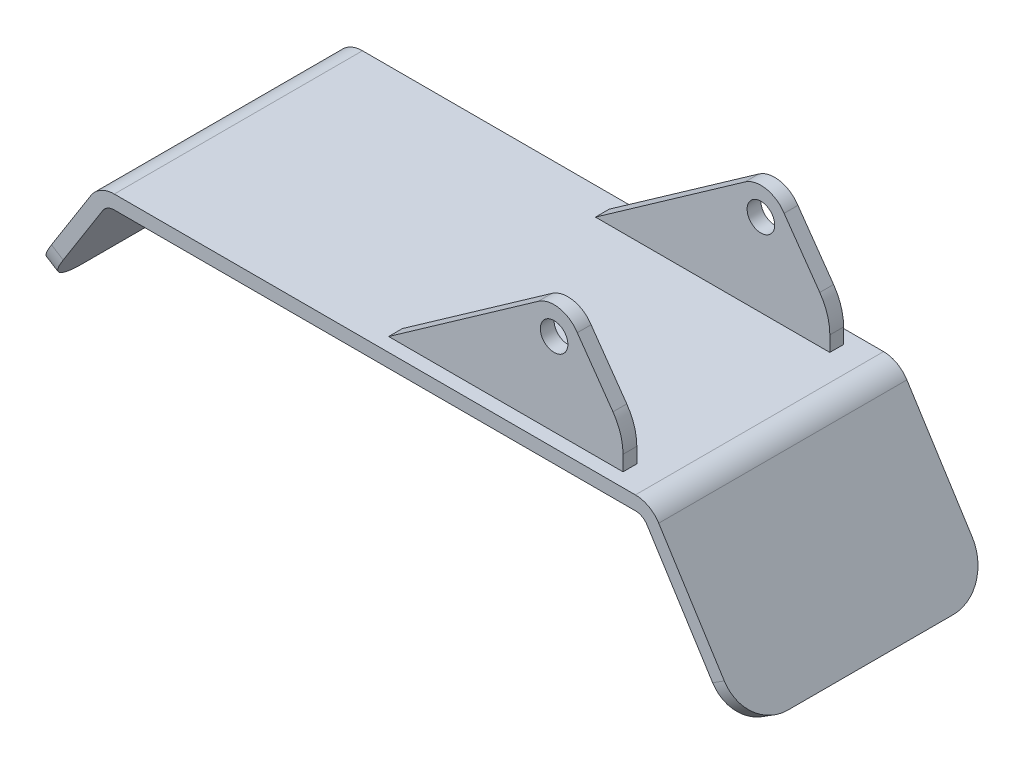
ISO-10303-21;
HEADER;
FILE_DESCRIPTION(('STEP AP214'),'2;1');
FILE_NAME('part.step','',(''),(''),'','','');
FILE_SCHEMA(('AUTOMOTIVE_DESIGN { 1 0 10303 214 1 1 1 1 }'));
ENDSEC;
DATA;
#1=APPLICATION_CONTEXT('core data for automotive mechanical design processes');
#2=APPLICATION_PROTOCOL_DEFINITION('international standard','automotive_design',2000,#1);
#3=PRODUCT_CONTEXT('',#1,'mechanical');
#4=PRODUCT('Part','Part','',(#3));
#5=PRODUCT_RELATED_PRODUCT_CATEGORY('part','',(#4));
#6=PRODUCT_DEFINITION_FORMATION('','',#4);
#7=PRODUCT_DEFINITION_CONTEXT('part definition',#1,'design');
#8=PRODUCT_DEFINITION('design','',#6,#7);
#9=PRODUCT_DEFINITION_SHAPE('','',#8);
#10=(LENGTH_UNIT() NAMED_UNIT(*) SI_UNIT(.MILLI.,.METRE.));
#11=(NAMED_UNIT(*) PLANE_ANGLE_UNIT() SI_UNIT($,.RADIAN.));
#12=(NAMED_UNIT(*) SI_UNIT($,.STERADIAN.) SOLID_ANGLE_UNIT());
#13=UNCERTAINTY_MEASURE_WITH_UNIT(LENGTH_MEASURE(1.E-05),#10,'distance_accuracy_value','');
#14=(GEOMETRIC_REPRESENTATION_CONTEXT(3) GLOBAL_UNCERTAINTY_ASSIGNED_CONTEXT((#13)) GLOBAL_UNIT_ASSIGNED_CONTEXT((#10,
#11,#12)) REPRESENTATION_CONTEXT('',''));
#15=CARTESIAN_POINT('',(0.,0.,0.));
#16=DIRECTION('',(0.,0.,1.));
#17=DIRECTION('',(1.,0.,0.));
#18=AXIS2_PLACEMENT_3D('',#15,#16,#17);
#19=CARTESIAN_POINT('',(18.897662625869,0.,9.));
#20=DIRECTION('',(0.,-1.,0.));
#21=DIRECTION('',(0.,0.,-1.));
#22=AXIS2_PLACEMENT_3D('',#19,#20,#21);
#23=PLANE('',#22);
#24=DIRECTION('',(-1.,0.,0.));
#25=VECTOR('',#24,1.);
#26=CARTESIAN_POINT('',(18.897662625869,0.,-9.));
#27=LINE('',#26,#25);
#28=CARTESIAN_POINT('',(18.897662625869,0.,-9.));
#29=VERTEX_POINT('',#28);
#30=CARTESIAN_POINT('',(-18.897662625869,0.,-9.));
#31=VERTEX_POINT('',#30);
#32=EDGE_CURVE('E336',#29,#31,#27,.T.);
#33=ORIENTED_EDGE('',*,*,#32,.T.);
#34=DIRECTION('',(0.,0.,-1.));
#35=VECTOR('',#34,1.);
#36=CARTESIAN_POINT('',(-18.897662625869,0.,9.));
#37=LINE('',#36,#35);
#38=CARTESIAN_POINT('',(-18.897662625869,0.,9.));
#39=VERTEX_POINT('',#38);
#40=EDGE_CURVE('E370',#39,#31,#37,.T.);
#41=ORIENTED_EDGE('',*,*,#40,.F.);
#42=DIRECTION('',(-1.,0.,0.));
#43=VECTOR('',#42,1.);
#44=CARTESIAN_POINT('',(18.897662625869,0.,9.));
#45=LINE('',#44,#43);
#46=CARTESIAN_POINT('',(18.897662625869,0.,9.));
#47=VERTEX_POINT('',#46);
#48=EDGE_CURVE('E320',#47,#39,#45,.T.);
#49=ORIENTED_EDGE('',*,*,#48,.F.);
#50=DIRECTION('',(0.,0.,-1.));
#51=VECTOR('',#50,1.);
#52=CARTESIAN_POINT('',(18.897662625869,0.,9.));
#53=LINE('',#52,#51);
#54=EDGE_CURVE('E367',#47,#29,#53,.T.);
#55=ORIENTED_EDGE('',*,*,#54,.T.);
#56=EDGE_LOOP('',(#33,#41,#49,#55));
#57=FACE_BOUND('',#56,.T.);
#58=DIRECTION('',(0.,0.,-1.));
#59=VECTOR('',#58,1.);
#60=CARTESIAN_POINT('',(0.,0.,-7.));
#61=LINE('',#60,#59);
#62=CARTESIAN_POINT('',(0.,0.,-7.));
#63=VERTEX_POINT('',#62);
#64=CARTESIAN_POINT('',(0.,0.,-8.));
#65=VERTEX_POINT('',#64);
#66=EDGE_CURVE('E274',#63,#65,#61,.T.);
#67=ORIENTED_EDGE('',*,*,#66,.T.);
#68=DIRECTION('',(1.,0.,0.));
#69=VECTOR('',#68,1.);
#70=CARTESIAN_POINT('',(17.,0.,-8.));
#71=LINE('',#70,#69);
#72=CARTESIAN_POINT('',(17.,0.,-8.));
#73=VERTEX_POINT('',#72);
#74=EDGE_CURVE('E259',#65,#73,#71,.T.);
#75=ORIENTED_EDGE('',*,*,#74,.T.);
#76=DIRECTION('',(0.,0.,-1.));
#77=VECTOR('',#76,1.);
#78=CARTESIAN_POINT('',(17.,0.,-7.));
#79=LINE('',#78,#77);
#80=CARTESIAN_POINT('',(17.,0.,-7.));
#81=VERTEX_POINT('',#80);
#82=EDGE_CURVE('E305',#81,#73,#79,.T.);
#83=ORIENTED_EDGE('',*,*,#82,.F.);
#84=DIRECTION('',(1.,0.,0.));
#85=VECTOR('',#84,1.);
#86=CARTESIAN_POINT('',(17.,0.,-7.));
#87=LINE('',#86,#85);
#88=EDGE_CURVE('E261',#63,#81,#87,.T.);
#89=ORIENTED_EDGE('',*,*,#88,.F.);
#90=EDGE_LOOP('',(#67,#75,#83,#89));
#91=FACE_BOUND('',#90,.T.);
#92=DIRECTION('',(1.,0.,0.));
#93=VECTOR('',#92,1.);
#94=CARTESIAN_POINT('',(17.,0.,7.));
#95=LINE('',#94,#93);
#96=CARTESIAN_POINT('',(0.,0.,7.));
#97=VERTEX_POINT('',#96);
#98=CARTESIAN_POINT('',(17.,0.,7.));
#99=VERTEX_POINT('',#98);
#100=EDGE_CURVE('E223',#97,#99,#95,.T.);
#101=ORIENTED_EDGE('',*,*,#100,.T.);
#102=DIRECTION('',(0.,0.,1.));
#103=VECTOR('',#102,1.);
#104=CARTESIAN_POINT('',(17.,0.,7.));
#105=LINE('',#104,#103);
#106=CARTESIAN_POINT('',(17.,0.,8.));
#107=VERTEX_POINT('',#106);
#108=EDGE_CURVE('E610',#99,#107,#105,.T.);
#109=ORIENTED_EDGE('',*,*,#108,.T.);
#110=DIRECTION('',(1.,0.,0.));
#111=VECTOR('',#110,1.);
#112=CARTESIAN_POINT('',(17.,0.,8.));
#113=LINE('',#112,#111);
#114=CARTESIAN_POINT('',(0.,0.,8.));
#115=VERTEX_POINT('',#114);
#116=EDGE_CURVE('E248',#115,#107,#113,.T.);
#117=ORIENTED_EDGE('',*,*,#116,.F.);
#118=DIRECTION('',(0.,0.,1.));
#119=VECTOR('',#118,1.);
#120=CARTESIAN_POINT('',(0.,0.,7.));
#121=LINE('',#120,#119);
#122=EDGE_CURVE('E242',#97,#115,#121,.T.);
#123=ORIENTED_EDGE('',*,*,#122,.F.);
#124=EDGE_LOOP('',(#101,#109,#117,#123));
#125=FACE_BOUND('',#124,.T.);
#126=ADVANCED_FACE('F39',(#57,#91,#125),#23,.F.);
#127=CARTESIAN_POINT('',(18.897662625869,-2.,9.));
#128=DIRECTION('',(0.,0.,-1.));
#129=DIRECTION('',(-1.,0.,0.));
#130=AXIS2_PLACEMENT_3D('',#127,#128,#129);
#131=CYLINDRICAL_SURFACE('',#130,0.999999999999999);
#132=CARTESIAN_POINT('',(18.897662625869,-2.,-9.));
#133=DIRECTION('',(0.,0.,-1.));
#134=DIRECTION('',(-1.,0.,0.));
#135=AXIS2_PLACEMENT_3D('',#132,#133,#134);
#136=CIRCLE('',#135,0.999999999999999);
#137=CARTESIAN_POINT('',(18.897662625869,-1.,-9.));
#138=VERTEX_POINT('',#137);
#139=CARTESIAN_POINT('',(19.7431515289,-1.46600700861203,-9.));
#140=VERTEX_POINT('',#139);
#141=EDGE_CURVE('E301',#138,#140,#136,.T.);
#142=ORIENTED_EDGE('',*,*,#141,.T.);
#143=DIRECTION('',(0.,0.,-1.));
#144=VECTOR('',#143,1.);
#145=CARTESIAN_POINT('',(19.7431515289,-1.46600700861203,9.));
#146=LINE('',#145,#144);
#147=CARTESIAN_POINT('',(19.7431515289,-1.46600700861203,9.));
#148=VERTEX_POINT('',#147);
#149=EDGE_CURVE('E385',#148,#140,#146,.T.);
#150=ORIENTED_EDGE('',*,*,#149,.F.);
#151=CARTESIAN_POINT('',(18.897662625869,-2.,9.));
#152=DIRECTION('',(0.,0.,-1.));
#153=DIRECTION('',(-1.,0.,0.));
#154=AXIS2_PLACEMENT_3D('',#151,#152,#153);
#155=CIRCLE('',#154,0.999999999999999);
#156=CARTESIAN_POINT('',(18.897662625869,-1.,9.));
#157=VERTEX_POINT('',#156);
#158=EDGE_CURVE('E308',#157,#148,#155,.T.);
#159=ORIENTED_EDGE('',*,*,#158,.F.);
#160=DIRECTION('',(0.,0.,-1.));
#161=VECTOR('',#160,1.);
#162=CARTESIAN_POINT('',(18.897662625869,-1.,9.));
#163=LINE('',#162,#161);
#164=EDGE_CURVE('E329',#157,#138,#163,.T.);
#165=ORIENTED_EDGE('',*,*,#164,.T.);
#166=EDGE_LOOP('',(#142,#150,#159,#165));
#167=FACE_BOUND('',#166,.T.);
#168=ADVANCED_FACE('F453',(#167),#131,.F.);
#169=CARTESIAN_POINT('',(19.7431515289,-1.46600700861203,9.));
#170=DIRECTION('',(0.845488903030971,0.533992991387982,0.));
#171=DIRECTION('',(-0.533992991387982,0.845488903030971,0.));
#172=AXIS2_PLACEMENT_3D('',#169,#170,#171);
#173=PLANE('',#172);
#174=DIRECTION('',(0.,0.,-1.));
#175=VECTOR('',#174,1.);
#176=CARTESIAN_POINT('',(26.1018795180217,-11.533992991388,9.));
#177=LINE('',#176,#175);
#178=CARTESIAN_POINT('',(26.1018795180217,-11.533992991388,6.));
#179=VERTEX_POINT('',#178);
#180=CARTESIAN_POINT('',(26.1018795180217,-11.533992991388,-6.));
#181=VERTEX_POINT('',#180);
#182=EDGE_CURVE('E377',#179,#181,#177,.T.);
#183=ORIENTED_EDGE('',*,*,#182,.F.);
#184=CARTESIAN_POINT('',(24.4999005438577,-8.99752628229507,6.));
#185=DIRECTION('',(0.845488903030971,0.533992991387982,0.));
#186=DIRECTION('',(-0.533992991387982,0.845488903030971,0.));
#187=AXIS2_PLACEMENT_3D('',#184,#185,#186);
#188=CIRCLE('',#187,3.);
#189=CARTESIAN_POINT('',(24.4999005438577,-8.99752628229507,9.));
#190=VERTEX_POINT('',#189);
#191=EDGE_CURVE('E405',#179,#190,#188,.F.);
#192=ORIENTED_EDGE('',*,*,#191,.T.);
#193=DIRECTION('',(0.533992991387982,-0.845488903030971,0.));
#194=VECTOR('',#193,1.);
#195=CARTESIAN_POINT('',(19.7431515289,-1.46600700861203,9.));
#196=LINE('',#195,#194);
#197=EDGE_CURVE('E310',#148,#190,#196,.T.);
#198=ORIENTED_EDGE('',*,*,#197,.F.);
#199=ORIENTED_EDGE('',*,*,#149,.T.);
#200=DIRECTION('',(0.533992991387982,-0.845488903030971,0.));
#201=VECTOR('',#200,1.);
#202=CARTESIAN_POINT('',(19.7431515289,-1.46600700861203,-9.));
#203=LINE('',#202,#201);
#204=CARTESIAN_POINT('',(24.4999005438577,-8.99752628229507,-9.));
#205=VERTEX_POINT('',#204);
#206=EDGE_CURVE('E334',#140,#205,#203,.T.);
#207=ORIENTED_EDGE('',*,*,#206,.T.);
#208=CARTESIAN_POINT('',(24.4999005438577,-8.99752628229507,-6.));
#209=DIRECTION('',(0.845488903030971,0.533992991387982,0.));
#210=DIRECTION('',(-0.533992991387982,0.845488903030971,0.));
#211=AXIS2_PLACEMENT_3D('',#208,#209,#210);
#212=CIRCLE('',#211,3.);
#213=EDGE_CURVE('E396',#205,#181,#212,.F.);
#214=ORIENTED_EDGE('',*,*,#213,.T.);
#215=EDGE_LOOP('',(#183,#192,#198,#199,#207,#214));
#216=FACE_BOUND('',#215,.T.);
#217=ADVANCED_FACE('F457',(#216),#173,.F.);
#218=CARTESIAN_POINT('',(26.9473684210526,-11.,9.));
#219=DIRECTION('',(-0.533992991387984,0.84548890303097,0.));
#220=DIRECTION('',(-0.84548890303097,-0.533992991387984,0.));
#221=AXIS2_PLACEMENT_3D('',#218,#219,#220);
#222=PLANE('',#221);
#223=DIRECTION('',(0.,0.,-1.));
#224=VECTOR('',#223,1.);
#225=CARTESIAN_POINT('',(26.9473684210526,-11.,9.));
#226=LINE('',#225,#224);
#227=CARTESIAN_POINT('',(26.9473684210526,-11.,6.));
#228=VERTEX_POINT('',#227);
#229=CARTESIAN_POINT('',(26.9473684210526,-11.,-6.));
#230=VERTEX_POINT('',#229);
#231=EDGE_CURVE('E376',#228,#230,#226,.T.);
#232=ORIENTED_EDGE('',*,*,#231,.F.);
#233=DIRECTION('',(0.84548890303097,0.533992991387984,0.));
#234=VECTOR('',#233,1.);
#235=CARTESIAN_POINT('',(26.9473684210526,-11.,6.));
#236=LINE('',#235,#234);
#237=EDGE_CURVE('E398',#228,#179,#236,.F.);
#238=ORIENTED_EDGE('',*,*,#237,.T.);
#239=ORIENTED_EDGE('',*,*,#182,.T.);
#240=DIRECTION('',(0.84548890303097,0.533992991387984,0.));
#241=VECTOR('',#240,1.);
#242=CARTESIAN_POINT('',(26.9473684210526,-11.,-6.));
#243=LINE('',#242,#241);
#244=EDGE_CURVE('E391',#181,#230,#243,.T.);
#245=ORIENTED_EDGE('',*,*,#244,.T.);
#246=EDGE_LOOP('',(#232,#238,#239,#245));
#247=FACE_BOUND('',#246,.T.);
#248=ADVANCED_FACE('F484',(#247),#222,.F.);
#249=CARTESIAN_POINT('',(20.588640431931,-0.932014017224044,9.));
#250=DIRECTION('',(-0.845488903030971,-0.533992991387982,0.));
#251=DIRECTION('',(0.533992991387982,-0.845488903030971,0.));
#252=AXIS2_PLACEMENT_3D('',#249,#250,#251);
#253=PLANE('',#252);
#254=DIRECTION('',(-0.533992991387982,0.845488903030971,0.));
#255=VECTOR('',#254,1.);
#256=CARTESIAN_POINT('',(20.588640431931,-0.932014017224044,9.));
#257=LINE('',#256,#255);
#258=CARTESIAN_POINT('',(25.3453894468887,-8.46353329090708,9.));
#259=VERTEX_POINT('',#258);
#260=CARTESIAN_POINT('',(20.588640431931,-0.932014017224044,9.));
#261=VERTEX_POINT('',#260);
#262=EDGE_CURVE('E311',#259,#261,#257,.T.);
#263=ORIENTED_EDGE('',*,*,#262,.F.);
#264=CARTESIAN_POINT('',(25.3453894468887,-8.46353329090709,6.));
#265=DIRECTION('',(-0.845488903030971,-0.533992991387982,0.));
#266=DIRECTION('',(0.533992991387982,-0.845488903030971,0.));
#267=AXIS2_PLACEMENT_3D('',#264,#265,#266);
#268=CIRCLE('',#267,3.);
#269=EDGE_CURVE('E392',#259,#228,#268,.F.);
#270=ORIENTED_EDGE('',*,*,#269,.T.);
#271=ORIENTED_EDGE('',*,*,#231,.T.);
#272=CARTESIAN_POINT('',(25.3453894468887,-8.46353329090709,-6.));
#273=DIRECTION('',(-0.845488903030971,-0.533992991387982,0.));
#274=DIRECTION('',(0.533992991387982,-0.845488903030971,0.));
#275=AXIS2_PLACEMENT_3D('',#272,#273,#274);
#276=CIRCLE('',#275,3.);
#277=CARTESIAN_POINT('',(25.3453894468887,-8.46353329090708,-9.));
#278=VERTEX_POINT('',#277);
#279=EDGE_CURVE('E393',#230,#278,#276,.F.);
#280=ORIENTED_EDGE('',*,*,#279,.T.);
#281=DIRECTION('',(-0.533992991387982,0.845488903030971,0.));
#282=VECTOR('',#281,1.);
#283=CARTESIAN_POINT('',(20.588640431931,-0.932014017224044,-9.));
#284=LINE('',#283,#282);
#285=CARTESIAN_POINT('',(20.588640431931,-0.932014017224044,-9.));
#286=VERTEX_POINT('',#285);
#287=EDGE_CURVE('E338',#278,#286,#284,.T.);
#288=ORIENTED_EDGE('',*,*,#287,.T.);
#289=DIRECTION('',(0.,0.,-1.));
#290=VECTOR('',#289,1.);
#291=CARTESIAN_POINT('',(20.588640431931,-0.932014017224044,9.));
#292=LINE('',#291,#290);
#293=EDGE_CURVE('E373',#261,#286,#292,.T.);
#294=ORIENTED_EDGE('',*,*,#293,.F.);
#295=EDGE_LOOP('',(#263,#270,#271,#280,#288,#294));
#296=FACE_BOUND('',#295,.T.);
#297=ADVANCED_FACE('F461',(#296),#253,.F.);
#298=CARTESIAN_POINT('',(18.897662625869,-2.,9.));
#299=DIRECTION('',(0.,0.,-1.));
#300=DIRECTION('',(-1.,0.,0.));
#301=AXIS2_PLACEMENT_3D('',#298,#299,#300);
#302=CYLINDRICAL_SURFACE('',#301,2.);
#303=CARTESIAN_POINT('',(18.897662625869,-2.,-9.));
#304=DIRECTION('',(0.,0.,1.));
#305=DIRECTION('',(-1.,0.,0.));
#306=AXIS2_PLACEMENT_3D('',#303,#304,#305);
#307=CIRCLE('',#306,2.);
#308=EDGE_CURVE('E337',#286,#29,#307,.T.);
#309=ORIENTED_EDGE('',*,*,#308,.T.);
#310=ORIENTED_EDGE('',*,*,#54,.F.);
#311=CARTESIAN_POINT('',(18.897662625869,-2.,9.));
#312=DIRECTION('',(0.,0.,1.));
#313=DIRECTION('',(-1.,0.,0.));
#314=AXIS2_PLACEMENT_3D('',#311,#312,#313);
#315=CIRCLE('',#314,2.);
#316=EDGE_CURVE('E312',#261,#47,#315,.T.);
#317=ORIENTED_EDGE('',*,*,#316,.F.);
#318=ORIENTED_EDGE('',*,*,#293,.T.);
#319=EDGE_LOOP('',(#309,#310,#317,#318));
#320=FACE_BOUND('',#319,.T.);
#321=ADVANCED_FACE('F473',(#320),#302,.T.);
#322=CARTESIAN_POINT('',(-18.897662625869,-2.,9.));
#323=DIRECTION('',(0.,0.,-1.));
#324=DIRECTION('',(-1.,0.,0.));
#325=AXIS2_PLACEMENT_3D('',#322,#323,#324);
#326=CYLINDRICAL_SURFACE('',#325,2.);
#327=CARTESIAN_POINT('',(-18.897662625869,-2.,-9.));
#328=DIRECTION('',(0.,0.,1.));
#329=DIRECTION('',(1.,0.,0.));
#330=AXIS2_PLACEMENT_3D('',#327,#328,#329);
#331=CIRCLE('',#330,2.);
#332=CARTESIAN_POINT('',(-20.588640431931,-0.932014017224045,-9.));
#333=VERTEX_POINT('',#332);
#334=EDGE_CURVE('E345',#31,#333,#331,.T.);
#335=ORIENTED_EDGE('',*,*,#334,.T.);
#336=DIRECTION('',(0.,0.,-1.));
#337=VECTOR('',#336,1.);
#338=CARTESIAN_POINT('',(-20.588640431931,-0.932014017224045,9.));
#339=LINE('',#338,#337);
#340=CARTESIAN_POINT('',(-20.588640431931,-0.932014017224045,9.));
#341=VERTEX_POINT('',#340);
#342=EDGE_CURVE('E365',#341,#333,#339,.T.);
#343=ORIENTED_EDGE('',*,*,#342,.F.);
#344=CARTESIAN_POINT('',(-18.897662625869,-2.,9.));
#345=DIRECTION('',(0.,0.,1.));
#346=DIRECTION('',(1.,0.,0.));
#347=AXIS2_PLACEMENT_3D('',#344,#345,#346);
#348=CIRCLE('',#347,2.);
#349=EDGE_CURVE('E317',#39,#341,#348,.T.);
#350=ORIENTED_EDGE('',*,*,#349,.F.);
#351=ORIENTED_EDGE('',*,*,#40,.T.);
#352=EDGE_LOOP('',(#335,#343,#350,#351));
#353=FACE_BOUND('',#352,.T.);
#354=ADVANCED_FACE('F479',(#353),#326,.T.);
#355=CARTESIAN_POINT('',(-20.588640431931,-0.932014017224045,9.));
#356=DIRECTION('',(0.845488903030971,-0.533992991387981,0.));
#357=DIRECTION('',(0.533992991387982,0.845488903030971,0.));
#358=AXIS2_PLACEMENT_3D('',#355,#356,#357);
#359=PLANE('',#358);
#360=DIRECTION('',(-0.533992991387981,-0.845488903030971,0.));
#361=VECTOR('',#360,1.);
#362=CARTESIAN_POINT('',(-20.588640431931,-0.932014017224045,-9.));
#363=LINE('',#362,#361);
#364=CARTESIAN_POINT('',(-23.4506526047834,-5.46353329090708,-9.));
#365=VERTEX_POINT('',#364);
#366=EDGE_CURVE('E344',#333,#365,#363,.T.);
#367=ORIENTED_EDGE('',*,*,#366,.T.);
#368=CARTESIAN_POINT('',(-23.4506526047834,-5.46353329090709,-6.));
#369=DIRECTION('',(0.845488903030971,-0.533992991387981,0.));
#370=DIRECTION('',(0.533992991387982,0.845488903030971,0.));
#371=AXIS2_PLACEMENT_3D('',#368,#369,#370);
#372=CIRCLE('',#371,3.);
#373=CARTESIAN_POINT('',(-25.0526315789474,-8.,-6.));
#374=VERTEX_POINT('',#373);
#375=EDGE_CURVE('E11',#365,#374,#372,.F.);
#376=ORIENTED_EDGE('',*,*,#375,.T.);
#377=DIRECTION('',(0.,0.,-1.));
#378=VECTOR('',#377,1.);
#379=CARTESIAN_POINT('',(-25.0526315789474,-8.,9.));
#380=LINE('',#379,#378);
#381=CARTESIAN_POINT('',(-25.0526315789474,-8.,6.));
#382=VERTEX_POINT('',#381);
#383=EDGE_CURVE('E362',#382,#374,#380,.T.);
#384=ORIENTED_EDGE('',*,*,#383,.F.);
#385=CARTESIAN_POINT('',(-23.4506526047834,-5.46353329090708,6.));
#386=DIRECTION('',(0.845488903030971,-0.533992991387981,0.));
#387=DIRECTION('',(0.533992991387982,0.845488903030971,0.));
#388=AXIS2_PLACEMENT_3D('',#385,#386,#387);
#389=CIRCLE('',#388,3.);
#390=CARTESIAN_POINT('',(-23.4506526047834,-5.46353329090708,9.));
#391=VERTEX_POINT('',#390);
#392=EDGE_CURVE('E50',#382,#391,#389,.F.);
#393=ORIENTED_EDGE('',*,*,#392,.T.);
#394=DIRECTION('',(-0.533992991387981,-0.845488903030971,0.));
#395=VECTOR('',#394,1.);
#396=CARTESIAN_POINT('',(-20.588640431931,-0.932014017224045,9.));
#397=LINE('',#396,#395);
#398=EDGE_CURVE('E321',#341,#391,#397,.T.);
#399=ORIENTED_EDGE('',*,*,#398,.F.);
#400=ORIENTED_EDGE('',*,*,#342,.T.);
#401=EDGE_LOOP('',(#367,#376,#384,#393,#399,#400));
#402=FACE_BOUND('',#401,.T.);
#403=ADVANCED_FACE('F417',(#402),#359,.F.);
#404=CARTESIAN_POINT('',(-25.0526315789474,-8.,9.));
#405=DIRECTION('',(0.53399299138798,0.845488903030972,0.));
#406=DIRECTION('',(-0.845488903030972,0.53399299138798,0.));
#407=AXIS2_PLACEMENT_3D('',#404,#405,#406);
#408=PLANE('',#407);
#409=ORIENTED_EDGE('',*,*,#383,.T.);
#410=DIRECTION('',(0.845488903030972,-0.53399299138798,0.));
#411=VECTOR('',#410,1.);
#412=CARTESIAN_POINT('',(-24.2071426759164,-8.53399299138798,-6.));
#413=LINE('',#412,#411);
#414=CARTESIAN_POINT('',(-24.2071426759164,-8.53399299138798,-6.));
#415=VERTEX_POINT('',#414);
#416=EDGE_CURVE('E410',#374,#415,#413,.T.);
#417=ORIENTED_EDGE('',*,*,#416,.T.);
#418=DIRECTION('',(0.,0.,-1.));
#419=VECTOR('',#418,1.);
#420=CARTESIAN_POINT('',(-24.2071426759164,-8.53399299138798,9.));
#421=LINE('',#420,#419);
#422=CARTESIAN_POINT('',(-24.2071426759164,-8.53399299138798,6.));
#423=VERTEX_POINT('',#422);
#424=EDGE_CURVE('E359',#423,#415,#421,.T.);
#425=ORIENTED_EDGE('',*,*,#424,.F.);
#426=DIRECTION('',(0.845488903030972,-0.53399299138798,0.));
#427=VECTOR('',#426,1.);
#428=CARTESIAN_POINT('',(-25.0526315789474,-8.,6.));
#429=LINE('',#428,#427);
#430=EDGE_CURVE('E56',#423,#382,#429,.F.);
#431=ORIENTED_EDGE('',*,*,#430,.T.);
#432=EDGE_LOOP('',(#409,#417,#425,#431));
#433=FACE_BOUND('',#432,.T.);
#434=ADVANCED_FACE('F428',(#433),#408,.F.);
#435=CARTESIAN_POINT('',(-19.7431515289,-1.46600700861202,9.));
#436=DIRECTION('',(-0.845488903030971,0.533992991387982,0.));
#437=DIRECTION('',(-0.533992991387982,-0.845488903030971,0.));
#438=AXIS2_PLACEMENT_3D('',#435,#436,#437);
#439=PLANE('',#438);
#440=ORIENTED_EDGE('',*,*,#424,.T.);
#441=CARTESIAN_POINT('',(-22.6051637017524,-5.99752628229506,-6.));
#442=DIRECTION('',(-0.845488903030971,0.533992991387982,0.));
#443=DIRECTION('',(-0.533992991387982,-0.845488903030971,0.));
#444=AXIS2_PLACEMENT_3D('',#441,#442,#443);
#445=CIRCLE('',#444,3.);
#446=CARTESIAN_POINT('',(-22.6051637017524,-5.99752628229506,-9.));
#447=VERTEX_POINT('',#446);
#448=EDGE_CURVE('E414',#415,#447,#445,.F.);
#449=ORIENTED_EDGE('',*,*,#448,.T.);
#450=DIRECTION('',(0.533992991387982,0.845488903030971,0.));
#451=VECTOR('',#450,1.);
#452=CARTESIAN_POINT('',(-19.7431515289,-1.46600700861202,-9.));
#453=LINE('',#452,#451);
#454=CARTESIAN_POINT('',(-19.7431515289,-1.46600700861202,-9.));
#455=VERTEX_POINT('',#454);
#456=EDGE_CURVE('E347',#447,#455,#453,.T.);
#457=ORIENTED_EDGE('',*,*,#456,.T.);
#458=DIRECTION('',(0.,0.,-1.));
#459=VECTOR('',#458,1.);
#460=CARTESIAN_POINT('',(-19.7431515289,-1.46600700861202,9.));
#461=LINE('',#460,#459);
#462=CARTESIAN_POINT('',(-19.7431515289,-1.46600700861202,9.));
#463=VERTEX_POINT('',#462);
#464=EDGE_CURVE('E357',#463,#455,#461,.T.);
#465=ORIENTED_EDGE('',*,*,#464,.F.);
#466=DIRECTION('',(0.533992991387982,0.845488903030971,0.));
#467=VECTOR('',#466,1.);
#468=CARTESIAN_POINT('',(-19.7431515289,-1.46600700861202,9.));
#469=LINE('',#468,#467);
#470=CARTESIAN_POINT('',(-22.6051637017524,-5.99752628229506,9.));
#471=VERTEX_POINT('',#470);
#472=EDGE_CURVE('E322',#471,#463,#469,.T.);
#473=ORIENTED_EDGE('',*,*,#472,.F.);
#474=CARTESIAN_POINT('',(-22.6051637017524,-5.99752628229506,6.));
#475=DIRECTION('',(-0.845488903030971,0.533992991387982,0.));
#476=DIRECTION('',(-0.533992991387982,-0.845488903030971,0.));
#477=AXIS2_PLACEMENT_3D('',#474,#475,#476);
#478=CIRCLE('',#477,3.);
#479=EDGE_CURVE('E415',#471,#423,#478,.F.);
#480=ORIENTED_EDGE('',*,*,#479,.T.);
#481=EDGE_LOOP('',(#440,#449,#457,#465,#473,#480));
#482=FACE_BOUND('',#481,.T.);
#483=ADVANCED_FACE('F426',(#482),#439,.F.);
#484=CARTESIAN_POINT('',(-18.897662625869,-2.,9.));
#485=DIRECTION('',(0.,0.,-1.));
#486=DIRECTION('',(-1.,0.,0.));
#487=AXIS2_PLACEMENT_3D('',#484,#485,#486);
#488=CYLINDRICAL_SURFACE('',#487,0.999999999999999);
#489=CARTESIAN_POINT('',(-18.897662625869,-2.,-9.));
#490=DIRECTION('',(0.,0.,-1.));
#491=DIRECTION('',(1.,0.,0.));
#492=AXIS2_PLACEMENT_3D('',#489,#490,#491);
#493=CIRCLE('',#492,0.999999999999999);
#494=CARTESIAN_POINT('',(-18.897662625869,-1.,-9.));
#495=VERTEX_POINT('',#494);
#496=EDGE_CURVE('E346',#455,#495,#493,.T.);
#497=ORIENTED_EDGE('',*,*,#496,.T.);
#498=DIRECTION('',(0.,0.,-1.));
#499=VECTOR('',#498,1.);
#500=CARTESIAN_POINT('',(-18.897662625869,-1.,9.));
#501=LINE('',#500,#499);
#502=CARTESIAN_POINT('',(-18.897662625869,-1.,9.));
#503=VERTEX_POINT('',#502);
#504=EDGE_CURVE('E352',#503,#495,#501,.T.);
#505=ORIENTED_EDGE('',*,*,#504,.F.);
#506=CARTESIAN_POINT('',(-18.897662625869,-2.,9.));
#507=DIRECTION('',(0.,0.,-1.));
#508=DIRECTION('',(1.,0.,0.));
#509=AXIS2_PLACEMENT_3D('',#506,#507,#508);
#510=CIRCLE('',#509,0.999999999999999);
#511=EDGE_CURVE('E326',#463,#503,#510,.T.);
#512=ORIENTED_EDGE('',*,*,#511,.F.);
#513=ORIENTED_EDGE('',*,*,#464,.T.);
#514=EDGE_LOOP('',(#497,#505,#512,#513));
#515=FACE_BOUND('',#514,.T.);
#516=ADVANCED_FACE('F444',(#515),#488,.F.);
#517=CARTESIAN_POINT('',(18.897662625869,-1.,9.));
#518=DIRECTION('',(0.,1.,0.));
#519=DIRECTION('',(-1.,0.,0.));
#520=AXIS2_PLACEMENT_3D('',#517,#518,#519);
#521=PLANE('',#520);
#522=DIRECTION('',(1.,0.,0.));
#523=VECTOR('',#522,1.);
#524=CARTESIAN_POINT('',(18.897662625869,-1.,-9.));
#525=LINE('',#524,#523);
#526=EDGE_CURVE('E309',#495,#138,#525,.T.);
#527=ORIENTED_EDGE('',*,*,#526,.T.);
#528=ORIENTED_EDGE('',*,*,#164,.F.);
#529=DIRECTION('',(1.,0.,0.));
#530=VECTOR('',#529,1.);
#531=CARTESIAN_POINT('',(18.897662625869,-1.,9.));
#532=LINE('',#531,#530);
#533=EDGE_CURVE('E327',#503,#157,#532,.T.);
#534=ORIENTED_EDGE('',*,*,#533,.F.);
#535=ORIENTED_EDGE('',*,*,#504,.T.);
#536=EDGE_LOOP('',(#527,#528,#534,#535));
#537=FACE_BOUND('',#536,.T.);
#538=ADVANCED_FACE('F449',(#537),#521,.F.);
#539=CARTESIAN_POINT('',(18.897662625869,-2.,9.));
#540=DIRECTION('',(0.,0.,-1.));
#541=DIRECTION('',(-1.,0.,0.));
#542=AXIS2_PLACEMENT_3D('',#539,#540,#541);
#543=PLANE('',#542);
#544=ORIENTED_EDGE('',*,*,#197,.T.);
#545=DIRECTION('',(0.84548890303097,0.533992991387984,0.));
#546=VECTOR('',#545,1.);
#547=CARTESIAN_POINT('',(23.6544116408268,-9.53151927368304,9.));
#548=LINE('',#547,#546);
#549=EDGE_CURVE('E389',#190,#259,#548,.T.);
#550=ORIENTED_EDGE('',*,*,#549,.T.);
#551=ORIENTED_EDGE('',*,*,#262,.T.);
#552=ORIENTED_EDGE('',*,*,#316,.T.);
#553=ORIENTED_EDGE('',*,*,#48,.T.);
#554=ORIENTED_EDGE('',*,*,#349,.T.);
#555=ORIENTED_EDGE('',*,*,#398,.T.);
#556=DIRECTION('',(0.845488903030972,-0.53399299138798,0.));
#557=VECTOR('',#556,1.);
#558=CARTESIAN_POINT('',(5.25836958915473,-23.5955473081311,9.));
#559=LINE('',#558,#557);
#560=EDGE_CURVE('E384',#391,#471,#559,.T.);
#561=ORIENTED_EDGE('',*,*,#560,.T.);
#562=ORIENTED_EDGE('',*,*,#472,.T.);
#563=ORIENTED_EDGE('',*,*,#511,.T.);
#564=ORIENTED_EDGE('',*,*,#533,.T.);
#565=ORIENTED_EDGE('',*,*,#158,.T.);
#566=EDGE_LOOP('',(#544,#550,#551,#552,#553,#554,#555,#561,#562,#563,#564,#565));
#567=FACE_BOUND('',#566,.T.);
#568=ADVANCED_FACE('F423',(#567),#543,.F.);
#569=CARTESIAN_POINT('',(18.897662625869,-2.,-9.));
#570=DIRECTION('',(0.,0.,-1.));
#571=DIRECTION('',(-1.,0.,0.));
#572=AXIS2_PLACEMENT_3D('',#569,#570,#571);
#573=PLANE('',#572);
#574=ORIENTED_EDGE('',*,*,#287,.F.);
#575=DIRECTION('',(0.84548890303097,0.533992991387984,0.));
#576=VECTOR('',#575,1.);
#577=CARTESIAN_POINT('',(24.4999005438577,-8.99752628229507,-9.));
#578=LINE('',#577,#576);
#579=EDGE_CURVE('E408',#278,#205,#578,.F.);
#580=ORIENTED_EDGE('',*,*,#579,.T.);
#581=ORIENTED_EDGE('',*,*,#206,.F.);
#582=ORIENTED_EDGE('',*,*,#141,.F.);
#583=ORIENTED_EDGE('',*,*,#526,.F.);
#584=ORIENTED_EDGE('',*,*,#496,.F.);
#585=ORIENTED_EDGE('',*,*,#456,.F.);
#586=DIRECTION('',(0.845488903030972,-0.53399299138798,0.));
#587=VECTOR('',#586,1.);
#588=CARTESIAN_POINT('',(-23.4506526047834,-5.46353329090708,-9.));
#589=LINE('',#588,#587);
#590=EDGE_CURVE('E404',#447,#365,#589,.F.);
#591=ORIENTED_EDGE('',*,*,#590,.T.);
#592=ORIENTED_EDGE('',*,*,#366,.F.);
#593=ORIENTED_EDGE('',*,*,#334,.F.);
#594=ORIENTED_EDGE('',*,*,#32,.F.);
#595=ORIENTED_EDGE('',*,*,#308,.F.);
#596=EDGE_LOOP('',(#574,#580,#581,#582,#583,#584,#585,#591,#592,#593,#594,#595));
#597=FACE_BOUND('',#596,.T.);
#598=ADVANCED_FACE('F440',(#597),#573,.T.);
#599=CARTESIAN_POINT('',(12.,6.,-7.));
#600=DIRECTION('',(0.,0.,-1.));
#601=DIRECTION('',(-1.,0.,0.));
#602=AXIS2_PLACEMENT_3D('',#599,#600,#601);
#603=PLANE('',#602);
#604=ORIENTED_EDGE('',*,*,#88,.T.);
#605=DIRECTION('',(0.,1.,0.));
#606=VECTOR('',#605,1.);
#607=CARTESIAN_POINT('',(17.,1.10095121962288,-7.));
#608=LINE('',#607,#606);
#609=CARTESIAN_POINT('',(17.,1.10095121962288,-7.));
#610=VERTEX_POINT('',#609);
#611=EDGE_CURVE('E262',#81,#610,#608,.T.);
#612=ORIENTED_EDGE('',*,*,#611,.T.);
#613=CARTESIAN_POINT('',(13.,1.10095121962288,-7.));
#614=DIRECTION('',(0.,0.,1.));
#615=DIRECTION('',(-1.,0.,0.));
#616=AXIS2_PLACEMENT_3D('',#613,#614,#615);
#617=CIRCLE('',#616,4.);
#618=CARTESIAN_POINT('',(16.2710664430458,3.40315110781243,-7.));
#619=VERTEX_POINT('',#618);
#620=EDGE_CURVE('E270',#610,#619,#617,.T.);
#621=ORIENTED_EDGE('',*,*,#620,.T.);
#622=DIRECTION('',(-0.575549972047387,0.81776661076144,0.));
#623=VECTOR('',#622,1.);
#624=CARTESIAN_POINT('',(13.6839042748854,7.07910444027569,-7.));
#625=LINE('',#624,#623);
#626=CARTESIAN_POINT('',(13.6839042748854,7.07910444027569,-7.));
#627=VERTEX_POINT('',#626);
#628=EDGE_CURVE('E267',#619,#627,#625,.T.);
#629=ORIENTED_EDGE('',*,*,#628,.T.);
#630=CARTESIAN_POINT('',(12.,6.,-7.));
#631=DIRECTION('',(0.,0.,1.));
#632=DIRECTION('',(-1.,0.,0.));
#633=AXIS2_PLACEMENT_3D('',#630,#631,#632);
#634=CIRCLE('',#633,2.);
#635=CARTESIAN_POINT('',(10.8489000559052,7.63553322152288,-7.));
#636=VERTEX_POINT('',#635);
#637=EDGE_CURVE('E271',#627,#636,#634,.T.);
#638=ORIENTED_EDGE('',*,*,#637,.T.);
#639=DIRECTION('',(-0.81776661076144,-0.575549972047387,0.));
#640=VECTOR('',#639,1.);
#641=CARTESIAN_POINT('',(0.,0.,-7.));
#642=LINE('',#641,#640);
#643=EDGE_CURVE('E272',#636,#63,#642,.T.);
#644=ORIENTED_EDGE('',*,*,#643,.T.);
#645=EDGE_LOOP('',(#604,#612,#621,#629,#638,#644));
#646=FACE_BOUND('',#645,.T.);
#647=CARTESIAN_POINT('',(12.,6.,-7.));
#648=DIRECTION('',(0.,0.,1.));
#649=DIRECTION('',(1.,0.,0.));
#650=AXIS2_PLACEMENT_3D('',#647,#648,#649);
#651=CIRCLE('',#650,1.);
#652=CARTESIAN_POINT('',(13.,6.,-7.));
#653=VERTEX_POINT('',#652);
#654=EDGE_CURVE('E252',#653,#653,#651,.T.);
#655=ORIENTED_EDGE('',*,*,#654,.F.);
#656=EDGE_LOOP('',(#655));
#657=FACE_BOUND('',#656,.T.);
#658=ADVANCED_FACE('F521',(#646,#657),#603,.F.);
#659=CARTESIAN_POINT('',(12.,6.,-8.));
#660=DIRECTION('',(0.,0.,-1.));
#661=DIRECTION('',(-1.,0.,0.));
#662=AXIS2_PLACEMENT_3D('',#659,#660,#661);
#663=PLANE('',#662);
#664=ORIENTED_EDGE('',*,*,#74,.F.);
#665=DIRECTION('',(-0.81776661076144,-0.575549972047387,0.));
#666=VECTOR('',#665,1.);
#667=CARTESIAN_POINT('',(0.,0.,-8.));
#668=LINE('',#667,#666);
#669=CARTESIAN_POINT('',(10.8489000559052,7.63553322152288,-8.));
#670=VERTEX_POINT('',#669);
#671=EDGE_CURVE('E264',#670,#65,#668,.T.);
#672=ORIENTED_EDGE('',*,*,#671,.F.);
#673=CARTESIAN_POINT('',(12.,6.,-8.));
#674=DIRECTION('',(0.,0.,1.));
#675=DIRECTION('',(-1.,0.,0.));
#676=AXIS2_PLACEMENT_3D('',#673,#674,#675);
#677=CIRCLE('',#676,2.);
#678=CARTESIAN_POINT('',(13.6839042748854,7.07910444027569,-8.));
#679=VERTEX_POINT('',#678);
#680=EDGE_CURVE('E285',#679,#670,#677,.T.);
#681=ORIENTED_EDGE('',*,*,#680,.F.);
#682=DIRECTION('',(-0.575549972047387,0.81776661076144,0.));
#683=VECTOR('',#682,1.);
#684=CARTESIAN_POINT('',(13.6839042748854,7.07910444027569,-8.));
#685=LINE('',#684,#683);
#686=CARTESIAN_POINT('',(16.2710664430458,3.40315110781243,-8.));
#687=VERTEX_POINT('',#686);
#688=EDGE_CURVE('E284',#687,#679,#685,.T.);
#689=ORIENTED_EDGE('',*,*,#688,.F.);
#690=CARTESIAN_POINT('',(13.,1.10095121962288,-8.));
#691=DIRECTION('',(0.,0.,1.));
#692=DIRECTION('',(-1.,0.,0.));
#693=AXIS2_PLACEMENT_3D('',#690,#691,#692);
#694=CIRCLE('',#693,4.);
#695=CARTESIAN_POINT('',(17.,1.10095121962288,-8.));
#696=VERTEX_POINT('',#695);
#697=EDGE_CURVE('E278',#696,#687,#694,.T.);
#698=ORIENTED_EDGE('',*,*,#697,.F.);
#699=DIRECTION('',(0.,1.,0.));
#700=VECTOR('',#699,1.);
#701=CARTESIAN_POINT('',(17.,1.10095121962288,-8.));
#702=LINE('',#701,#700);
#703=EDGE_CURVE('E279',#73,#696,#702,.T.);
#704=ORIENTED_EDGE('',*,*,#703,.F.);
#705=EDGE_LOOP('',(#664,#672,#681,#689,#698,#704));
#706=FACE_BOUND('',#705,.T.);
#707=CARTESIAN_POINT('',(12.,6.,-8.));
#708=DIRECTION('',(0.,0.,1.));
#709=DIRECTION('',(1.,0.,0.));
#710=AXIS2_PLACEMENT_3D('',#707,#708,#709);
#711=CIRCLE('',#710,1.);
#712=CARTESIAN_POINT('',(13.,6.,-8.));
#713=VERTEX_POINT('',#712);
#714=EDGE_CURVE('E249',#713,#713,#711,.T.);
#715=ORIENTED_EDGE('',*,*,#714,.T.);
#716=EDGE_LOOP('',(#715));
#717=FACE_BOUND('',#716,.T.);
#718=ADVANCED_FACE('F535',(#706,#717),#663,.T.);
#719=CARTESIAN_POINT('',(17.,1.10095121962288,-7.));
#720=DIRECTION('',(-1.,0.,0.));
#721=DIRECTION('',(0.,0.,1.));
#722=AXIS2_PLACEMENT_3D('',#719,#720,#721);
#723=PLANE('',#722);
#724=ORIENTED_EDGE('',*,*,#703,.T.);
#725=DIRECTION('',(0.,0.,-1.));
#726=VECTOR('',#725,1.);
#727=CARTESIAN_POINT('',(17.,1.10095121962288,-7.));
#728=LINE('',#727,#726);
#729=EDGE_CURVE('E300',#610,#696,#728,.T.);
#730=ORIENTED_EDGE('',*,*,#729,.F.);
#731=ORIENTED_EDGE('',*,*,#611,.F.);
#732=ORIENTED_EDGE('',*,*,#82,.T.);
#733=EDGE_LOOP('',(#724,#730,#731,#732));
#734=FACE_BOUND('',#733,.T.);
#735=ADVANCED_FACE('F526',(#734),#723,.F.);
#736=CARTESIAN_POINT('',(13.,1.10095121962288,-7.));
#737=DIRECTION('',(0.,0.,-1.));
#738=DIRECTION('',(-1.,0.,0.));
#739=AXIS2_PLACEMENT_3D('',#736,#737,#738);
#740=CYLINDRICAL_SURFACE('',#739,4.);
#741=ORIENTED_EDGE('',*,*,#697,.T.);
#742=DIRECTION('',(0.,0.,-1.));
#743=VECTOR('',#742,1.);
#744=CARTESIAN_POINT('',(16.2710664430458,3.40315110781243,-7.));
#745=LINE('',#744,#743);
#746=EDGE_CURVE('E298',#619,#687,#745,.T.);
#747=ORIENTED_EDGE('',*,*,#746,.F.);
#748=ORIENTED_EDGE('',*,*,#620,.F.);
#749=ORIENTED_EDGE('',*,*,#729,.T.);
#750=EDGE_LOOP('',(#741,#747,#748,#749));
#751=FACE_BOUND('',#750,.T.);
#752=ADVANCED_FACE('F533',(#751),#740,.T.);
#753=CARTESIAN_POINT('',(13.6839042748854,7.07910444027569,-7.));
#754=DIRECTION('',(-0.81776661076144,-0.575549972047387,0.));
#755=DIRECTION('',(0.575549972047387,-0.81776661076144,0.));
#756=AXIS2_PLACEMENT_3D('',#753,#754,#755);
#757=PLANE('',#756);
#758=ORIENTED_EDGE('',*,*,#688,.T.);
#759=DIRECTION('',(0.,0.,-1.));
#760=VECTOR('',#759,1.);
#761=CARTESIAN_POINT('',(13.6839042748854,7.07910444027569,-7.));
#762=LINE('',#761,#760);
#763=EDGE_CURVE('E291',#627,#679,#762,.T.);
#764=ORIENTED_EDGE('',*,*,#763,.F.);
#765=ORIENTED_EDGE('',*,*,#628,.F.);
#766=ORIENTED_EDGE('',*,*,#746,.T.);
#767=EDGE_LOOP('',(#758,#764,#765,#766));
#768=FACE_BOUND('',#767,.T.);
#769=ADVANCED_FACE('F536',(#768),#757,.F.);
#770=CARTESIAN_POINT('',(12.,6.,-7.));
#771=DIRECTION('',(0.,0.,-1.));
#772=DIRECTION('',(-1.,0.,0.));
#773=AXIS2_PLACEMENT_3D('',#770,#771,#772);
#774=CYLINDRICAL_SURFACE('',#773,2.);
#775=ORIENTED_EDGE('',*,*,#680,.T.);
#776=DIRECTION('',(0.,0.,-1.));
#777=VECTOR('',#776,1.);
#778=CARTESIAN_POINT('',(10.8489000559052,7.63553322152288,-7.));
#779=LINE('',#778,#777);
#780=EDGE_CURVE('E286',#636,#670,#779,.T.);
#781=ORIENTED_EDGE('',*,*,#780,.F.);
#782=ORIENTED_EDGE('',*,*,#637,.F.);
#783=ORIENTED_EDGE('',*,*,#763,.T.);
#784=EDGE_LOOP('',(#775,#781,#782,#783));
#785=FACE_BOUND('',#784,.T.);
#786=ADVANCED_FACE('F539',(#785),#774,.T.);
#787=CARTESIAN_POINT('',(0.,0.,-7.));
#788=DIRECTION('',(0.575549972047387,-0.81776661076144,0.));
#789=DIRECTION('',(0.81776661076144,0.575549972047387,0.));
#790=AXIS2_PLACEMENT_3D('',#787,#788,#789);
#791=PLANE('',#790);
#792=ORIENTED_EDGE('',*,*,#671,.T.);
#793=ORIENTED_EDGE('',*,*,#66,.F.);
#794=ORIENTED_EDGE('',*,*,#643,.F.);
#795=ORIENTED_EDGE('',*,*,#780,.T.);
#796=EDGE_LOOP('',(#792,#793,#794,#795));
#797=FACE_BOUND('',#796,.T.);
#798=ADVANCED_FACE('F542',(#797),#791,.F.);
#799=CARTESIAN_POINT('',(12.,6.,-7.));
#800=DIRECTION('',(0.,0.,-1.));
#801=DIRECTION('',(-1.,0.,0.));
#802=AXIS2_PLACEMENT_3D('',#799,#800,#801);
#803=CYLINDRICAL_SURFACE('',#802,1.);
#804=ORIENTED_EDGE('',*,*,#654,.T.);
#805=EDGE_LOOP('',(#804));
#806=FACE_BOUND('',#805,.T.);
#807=ORIENTED_EDGE('',*,*,#714,.F.);
#808=EDGE_LOOP('',(#807));
#809=FACE_BOUND('',#808,.T.);
#810=ADVANCED_FACE('F547',(#806,#809),#803,.F.);
#811=CARTESIAN_POINT('',(0.,0.,7.));
#812=DIRECTION('',(-0.575549972047387,0.81776661076144,0.));
#813=DIRECTION('',(-0.81776661076144,-0.575549972047387,0.));
#814=AXIS2_PLACEMENT_3D('',#811,#812,#813);
#815=PLANE('',#814);
#816=DIRECTION('',(-0.81776661076144,-0.575549972047387,0.));
#817=VECTOR('',#816,1.);
#818=CARTESIAN_POINT('',(0.,0.,8.));
#819=LINE('',#818,#817);
#820=CARTESIAN_POINT('',(10.8489000559052,7.63553322152288,8.));
#821=VERTEX_POINT('',#820);
#822=EDGE_CURVE('E606',#821,#115,#819,.T.);
#823=ORIENTED_EDGE('',*,*,#822,.F.);
#824=DIRECTION('',(0.,0.,1.));
#825=VECTOR('',#824,1.);
#826=CARTESIAN_POINT('',(10.8489000559052,7.63553322152288,7.));
#827=LINE('',#826,#825);
#828=CARTESIAN_POINT('',(10.8489000559052,7.63553322152288,7.));
#829=VERTEX_POINT('',#828);
#830=EDGE_CURVE('E241',#829,#821,#827,.T.);
#831=ORIENTED_EDGE('',*,*,#830,.F.);
#832=DIRECTION('',(-0.81776661076144,-0.575549972047387,0.));
#833=VECTOR('',#832,1.);
#834=CARTESIAN_POINT('',(0.,0.,7.));
#835=LINE('',#834,#833);
#836=EDGE_CURVE('E230',#829,#97,#835,.T.);
#837=ORIENTED_EDGE('',*,*,#836,.T.);
#838=ORIENTED_EDGE('',*,*,#122,.T.);
#839=EDGE_LOOP('',(#823,#831,#837,#838));
#840=FACE_BOUND('',#839,.T.);
#841=ADVANCED_FACE('F244',(#840),#815,.T.);
#842=CARTESIAN_POINT('',(12.,6.,7.));
#843=DIRECTION('',(0.,0.,1.));
#844=DIRECTION('',(1.,0.,0.));
#845=AXIS2_PLACEMENT_3D('',#842,#843,#844);
#846=CYLINDRICAL_SURFACE('',#845,2.);
#847=CARTESIAN_POINT('',(12.,6.,8.));
#848=DIRECTION('',(0.,0.,1.));
#849=DIRECTION('',(-1.,0.,0.));
#850=AXIS2_PLACEMENT_3D('',#847,#848,#849);
#851=CIRCLE('',#850,2.);
#852=CARTESIAN_POINT('',(13.6839042748854,7.07910444027569,8.));
#853=VERTEX_POINT('',#852);
#854=EDGE_CURVE('E613',#853,#821,#851,.T.);
#855=ORIENTED_EDGE('',*,*,#854,.F.);
#856=DIRECTION('',(0.,0.,1.));
#857=VECTOR('',#856,1.);
#858=CARTESIAN_POINT('',(13.6839042748854,7.07910444027569,7.));
#859=LINE('',#858,#857);
#860=CARTESIAN_POINT('',(13.6839042748854,7.07910444027569,7.));
#861=VERTEX_POINT('',#860);
#862=EDGE_CURVE('E255',#861,#853,#859,.T.);
#863=ORIENTED_EDGE('',*,*,#862,.F.);
#864=CARTESIAN_POINT('',(12.,6.,7.));
#865=DIRECTION('',(0.,0.,1.));
#866=DIRECTION('',(-1.,0.,0.));
#867=AXIS2_PLACEMENT_3D('',#864,#865,#866);
#868=CIRCLE('',#867,2.);
#869=EDGE_CURVE('E247',#861,#829,#868,.T.);
#870=ORIENTED_EDGE('',*,*,#869,.T.);
#871=ORIENTED_EDGE('',*,*,#830,.T.);
#872=EDGE_LOOP('',(#855,#863,#870,#871));
#873=FACE_BOUND('',#872,.T.);
#874=ADVANCED_FACE('F560',(#873),#846,.T.);
#875=CARTESIAN_POINT('',(13.6839042748854,7.07910444027569,7.));
#876=DIRECTION('',(0.81776661076144,0.575549972047387,0.));
#877=DIRECTION('',(-0.575549972047387,0.81776661076144,0.));
#878=AXIS2_PLACEMENT_3D('',#875,#876,#877);
#879=PLANE('',#878);
#880=DIRECTION('',(-0.575549972047387,0.81776661076144,0.));
#881=VECTOR('',#880,1.);
#882=CARTESIAN_POINT('',(13.6839042748854,7.07910444027569,8.));
#883=LINE('',#882,#881);
#884=CARTESIAN_POINT('',(16.2710664430458,3.40315110781243,8.));
#885=VERTEX_POINT('',#884);
#886=EDGE_CURVE('E615',#885,#853,#883,.T.);
#887=ORIENTED_EDGE('',*,*,#886,.F.);
#888=DIRECTION('',(0.,0.,1.));
#889=VECTOR('',#888,1.);
#890=CARTESIAN_POINT('',(16.2710664430458,3.40315110781243,7.));
#891=LINE('',#890,#889);
#892=CARTESIAN_POINT('',(16.2710664430458,3.40315110781243,7.));
#893=VERTEX_POINT('',#892);
#894=EDGE_CURVE('E623',#893,#885,#891,.T.);
#895=ORIENTED_EDGE('',*,*,#894,.F.);
#896=DIRECTION('',(-0.575549972047387,0.81776661076144,0.));
#897=VECTOR('',#896,1.);
#898=CARTESIAN_POINT('',(13.6839042748854,7.07910444027569,7.));
#899=LINE('',#898,#897);
#900=EDGE_CURVE('E599',#893,#861,#899,.T.);
#901=ORIENTED_EDGE('',*,*,#900,.T.);
#902=ORIENTED_EDGE('',*,*,#862,.T.);
#903=EDGE_LOOP('',(#887,#895,#901,#902));
#904=FACE_BOUND('',#903,.T.);
#905=ADVANCED_FACE('F565',(#904),#879,.T.);
#906=CARTESIAN_POINT('',(13.,1.10095121962288,7.));
#907=DIRECTION('',(0.,0.,1.));
#908=DIRECTION('',(1.,0.,0.));
#909=AXIS2_PLACEMENT_3D('',#906,#907,#908);
#910=CYLINDRICAL_SURFACE('',#909,4.);
#911=CARTESIAN_POINT('',(13.,1.10095121962288,8.));
#912=DIRECTION('',(0.,0.,1.));
#913=DIRECTION('',(-1.,0.,0.));
#914=AXIS2_PLACEMENT_3D('',#911,#912,#913);
#915=CIRCLE('',#914,4.);
#916=CARTESIAN_POINT('',(17.,1.10095121962288,8.));
#917=VERTEX_POINT('',#916);
#918=EDGE_CURVE('E620',#917,#885,#915,.T.);
#919=ORIENTED_EDGE('',*,*,#918,.F.);
#920=DIRECTION('',(0.,0.,1.));
#921=VECTOR('',#920,1.);
#922=CARTESIAN_POINT('',(17.,1.10095121962288,7.));
#923=LINE('',#922,#921);
#924=CARTESIAN_POINT('',(17.,1.10095121962288,7.));
#925=VERTEX_POINT('',#924);
#926=EDGE_CURVE('E621',#925,#917,#923,.T.);
#927=ORIENTED_EDGE('',*,*,#926,.F.);
#928=CARTESIAN_POINT('',(13.,1.10095121962288,7.));
#929=DIRECTION('',(0.,0.,1.));
#930=DIRECTION('',(-1.,0.,0.));
#931=AXIS2_PLACEMENT_3D('',#928,#929,#930);
#932=CIRCLE('',#931,4.);
#933=EDGE_CURVE('E602',#925,#893,#932,.T.);
#934=ORIENTED_EDGE('',*,*,#933,.T.);
#935=ORIENTED_EDGE('',*,*,#894,.T.);
#936=EDGE_LOOP('',(#919,#927,#934,#935));
#937=FACE_BOUND('',#936,.T.);
#938=ADVANCED_FACE('F567',(#937),#910,.T.);
#939=CARTESIAN_POINT('',(17.,1.10095121962288,7.));
#940=DIRECTION('',(1.,0.,0.));
#941=DIRECTION('',(0.,0.,-1.));
#942=AXIS2_PLACEMENT_3D('',#939,#940,#941);
#943=PLANE('',#942);
#944=DIRECTION('',(0.,1.,0.));
#945=VECTOR('',#944,1.);
#946=CARTESIAN_POINT('',(17.,1.10095121962288,8.));
#947=LINE('',#946,#945);
#948=EDGE_CURVE('E240',#107,#917,#947,.T.);
#949=ORIENTED_EDGE('',*,*,#948,.F.);
#950=ORIENTED_EDGE('',*,*,#108,.F.);
#951=DIRECTION('',(0.,1.,0.));
#952=VECTOR('',#951,1.);
#953=CARTESIAN_POINT('',(17.,1.10095121962288,7.));
#954=LINE('',#953,#952);
#955=EDGE_CURVE('E233',#99,#925,#954,.T.);
#956=ORIENTED_EDGE('',*,*,#955,.T.);
#957=ORIENTED_EDGE('',*,*,#926,.T.);
#958=EDGE_LOOP('',(#949,#950,#956,#957));
#959=FACE_BOUND('',#958,.T.);
#960=ADVANCED_FACE('F568',(#959),#943,.T.);
#961=CARTESIAN_POINT('',(12.,6.,7.));
#962=DIRECTION('',(0.,0.,1.));
#963=DIRECTION('',(-1.,0.,0.));
#964=AXIS2_PLACEMENT_3D('',#961,#962,#963);
#965=PLANE('',#964);
#966=CARTESIAN_POINT('',(12.,6.,7.));
#967=DIRECTION('',(0.,0.,1.));
#968=DIRECTION('',(1.,0.,0.));
#969=AXIS2_PLACEMENT_3D('',#966,#967,#968);
#970=CIRCLE('',#969,1.);
#971=CARTESIAN_POINT('',(13.,6.,7.));
#972=VERTEX_POINT('',#971);
#973=EDGE_CURVE('E595',#972,#972,#970,.T.);
#974=ORIENTED_EDGE('',*,*,#973,.T.);
#975=EDGE_LOOP('',(#974));
#976=FACE_BOUND('',#975,.T.);
#977=ORIENTED_EDGE('',*,*,#100,.F.);
#978=ORIENTED_EDGE('',*,*,#836,.F.);
#979=ORIENTED_EDGE('',*,*,#869,.F.);
#980=ORIENTED_EDGE('',*,*,#900,.F.);
#981=ORIENTED_EDGE('',*,*,#933,.F.);
#982=ORIENTED_EDGE('',*,*,#955,.F.);
#983=EDGE_LOOP('',(#977,#978,#979,#980,#981,#982));
#984=FACE_BOUND('',#983,.T.);
#985=ADVANCED_FACE('F229',(#976,#984),#965,.F.);
#986=CARTESIAN_POINT('',(12.,6.,8.));
#987=DIRECTION('',(0.,0.,1.));
#988=DIRECTION('',(-1.,0.,0.));
#989=AXIS2_PLACEMENT_3D('',#986,#987,#988);
#990=PLANE('',#989);
#991=CARTESIAN_POINT('',(12.,6.,8.));
#992=DIRECTION('',(0.,0.,1.));
#993=DIRECTION('',(1.,0.,0.));
#994=AXIS2_PLACEMENT_3D('',#991,#992,#993);
#995=CIRCLE('',#994,1.);
#996=CARTESIAN_POINT('',(13.,6.,8.));
#997=VERTEX_POINT('',#996);
#998=EDGE_CURVE('E594',#997,#997,#995,.T.);
#999=ORIENTED_EDGE('',*,*,#998,.F.);
#1000=EDGE_LOOP('',(#999));
#1001=FACE_BOUND('',#1000,.T.);
#1002=ORIENTED_EDGE('',*,*,#116,.T.);
#1003=ORIENTED_EDGE('',*,*,#948,.T.);
#1004=ORIENTED_EDGE('',*,*,#918,.T.);
#1005=ORIENTED_EDGE('',*,*,#886,.T.);
#1006=ORIENTED_EDGE('',*,*,#854,.T.);
#1007=ORIENTED_EDGE('',*,*,#822,.T.);
#1008=EDGE_LOOP('',(#1002,#1003,#1004,#1005,#1006,#1007));
#1009=FACE_BOUND('',#1008,.T.);
#1010=ADVANCED_FACE('F571',(#1001,#1009),#990,.T.);
#1011=CARTESIAN_POINT('',(12.,6.,7.));
#1012=DIRECTION('',(0.,0.,1.));
#1013=DIRECTION('',(1.,0.,0.));
#1014=AXIS2_PLACEMENT_3D('',#1011,#1012,#1013);
#1015=CYLINDRICAL_SURFACE('',#1014,1.);
#1016=ORIENTED_EDGE('',*,*,#973,.F.);
#1017=EDGE_LOOP('',(#1016));
#1018=FACE_BOUND('',#1017,.T.);
#1019=ORIENTED_EDGE('',*,*,#998,.T.);
#1020=EDGE_LOOP('',(#1019));
#1021=FACE_BOUND('',#1020,.T.);
#1022=ADVANCED_FACE('F578',(#1018,#1021),#1015,.F.);
#1023=CARTESIAN_POINT('',(23.6544116408268,-9.53151927368304,6.));
#1024=DIRECTION('',(0.84548890303097,0.533992991387984,0.));
#1025=DIRECTION('',(-0.533992991387984,0.84548890303097,0.));
#1026=AXIS2_PLACEMENT_3D('',#1023,#1024,#1025);
#1027=CYLINDRICAL_SURFACE('',#1026,3.);
#1028=ORIENTED_EDGE('',*,*,#191,.F.);
#1029=ORIENTED_EDGE('',*,*,#237,.F.);
#1030=ORIENTED_EDGE('',*,*,#269,.F.);
#1031=ORIENTED_EDGE('',*,*,#549,.F.);
#1032=EDGE_LOOP('',(#1028,#1029,#1030,#1031));
#1033=FACE_BOUND('',#1032,.T.);
#1034=ADVANCED_FACE('F463',(#1033),#1027,.T.);
#1035=CARTESIAN_POINT('',(25.3453894468887,-8.46353329090709,-6.));
#1036=DIRECTION('',(-0.84548890303097,-0.533992991387984,0.));
#1037=DIRECTION('',(0.533992991387984,-0.84548890303097,0.));
#1038=AXIS2_PLACEMENT_3D('',#1035,#1036,#1037);
#1039=CYLINDRICAL_SURFACE('',#1038,3.);
#1040=ORIENTED_EDGE('',*,*,#213,.F.);
#1041=ORIENTED_EDGE('',*,*,#579,.F.);
#1042=ORIENTED_EDGE('',*,*,#279,.F.);
#1043=ORIENTED_EDGE('',*,*,#244,.F.);
#1044=EDGE_LOOP('',(#1040,#1041,#1042,#1043));
#1045=FACE_BOUND('',#1044,.T.);
#1046=ADVANCED_FACE('F485',(#1045),#1039,.T.);
#1047=CARTESIAN_POINT('',(-23.4506526047834,-5.46353329090708,-6.));
#1048=DIRECTION('',(-0.845488903030972,0.53399299138798,0.));
#1049=DIRECTION('',(-0.53399299138798,-0.845488903030972,0.));
#1050=AXIS2_PLACEMENT_3D('',#1047,#1048,#1049);
#1051=CYLINDRICAL_SURFACE('',#1050,3.);
#1052=ORIENTED_EDGE('',*,*,#375,.F.);
#1053=ORIENTED_EDGE('',*,*,#590,.F.);
#1054=ORIENTED_EDGE('',*,*,#448,.F.);
#1055=ORIENTED_EDGE('',*,*,#416,.F.);
#1056=EDGE_LOOP('',(#1052,#1053,#1054,#1055));
#1057=FACE_BOUND('',#1056,.T.);
#1058=ADVANCED_FACE('F431',(#1057),#1051,.T.);
#1059=CARTESIAN_POINT('',(5.25836958915473,-23.5955473081311,6.));
#1060=DIRECTION('',(0.845488903030972,-0.53399299138798,0.));
#1061=DIRECTION('',(0.53399299138798,0.845488903030972,0.));
#1062=AXIS2_PLACEMENT_3D('',#1059,#1060,#1061);
#1063=CYLINDRICAL_SURFACE('',#1062,3.);
#1064=ORIENTED_EDGE('',*,*,#392,.F.);
#1065=ORIENTED_EDGE('',*,*,#430,.F.);
#1066=ORIENTED_EDGE('',*,*,#479,.F.);
#1067=ORIENTED_EDGE('',*,*,#560,.F.);
#1068=EDGE_LOOP('',(#1064,#1065,#1066,#1067));
#1069=FACE_BOUND('',#1068,.T.);
#1070=ADVANCED_FACE('F41',(#1069),#1063,.T.);
#1071=CLOSED_SHELL('',(#126,#168,#217,#248,#297,#321,#354,#403,#434,#483,#516,#538,#568,#598,
#658,#718,#735,#752,#769,#786,#798,#810,#841,#874,#905,#938,#960,#985,#1010,#1022,#1034,#1046,
#1058,#1070));
#1072=MANIFOLD_SOLID_BREP('B2',#1071);
#1073=ADVANCED_BREP_SHAPE_REPRESENTATION('',(#18,#1072),#14);
#1074=SHAPE_DEFINITION_REPRESENTATION(#9,#1073);
ENDSEC;
END-ISO-10303-21;
